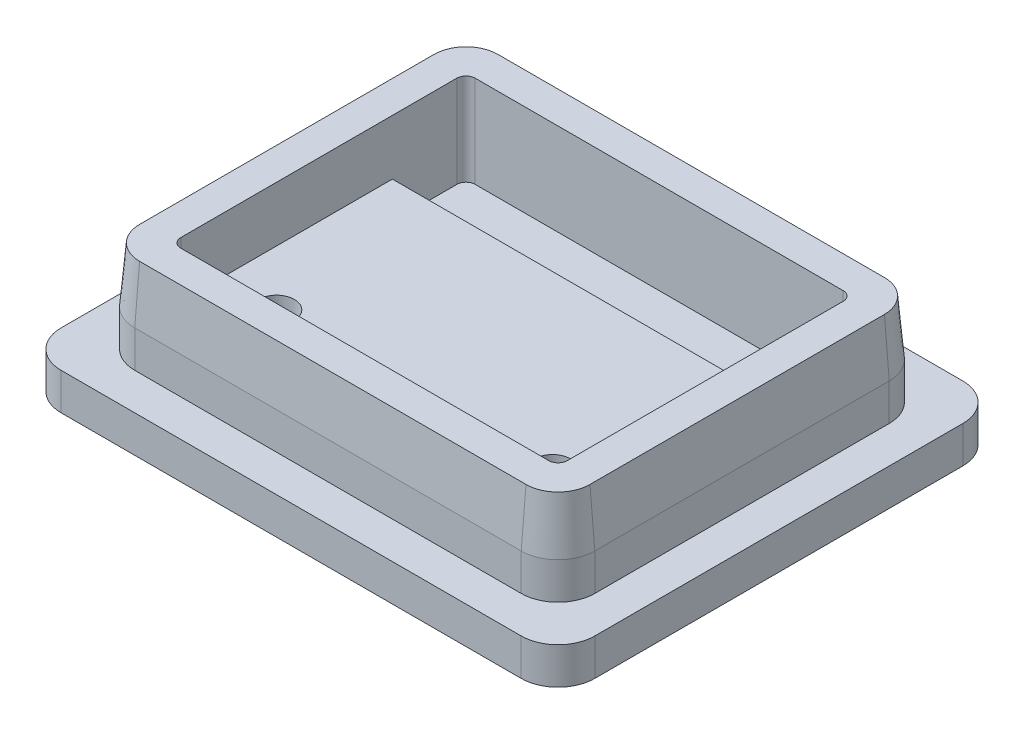
ISO-10303-21;
HEADER;
FILE_DESCRIPTION(('STEP AP214'),'2;1');
FILE_NAME('part.step','',(''),(''),'','','');
FILE_SCHEMA(('AUTOMOTIVE_DESIGN { 1 0 10303 214 1 1 1 1 }'));
ENDSEC;
DATA;
#1=APPLICATION_CONTEXT('core data for automotive mechanical design processes');
#2=APPLICATION_PROTOCOL_DEFINITION('international standard','automotive_design',2000,#1);
#3=PRODUCT_CONTEXT('',#1,'mechanical');
#4=PRODUCT('Part','Part','',(#3));
#5=PRODUCT_RELATED_PRODUCT_CATEGORY('part','',(#4));
#6=PRODUCT_DEFINITION_FORMATION('','',#4);
#7=PRODUCT_DEFINITION_CONTEXT('part definition',#1,'design');
#8=PRODUCT_DEFINITION('design','',#6,#7);
#9=PRODUCT_DEFINITION_SHAPE('','',#8);
#10=(LENGTH_UNIT() NAMED_UNIT(*) SI_UNIT(.MILLI.,.METRE.));
#11=(NAMED_UNIT(*) PLANE_ANGLE_UNIT() SI_UNIT($,.RADIAN.));
#12=(NAMED_UNIT(*) SI_UNIT($,.STERADIAN.) SOLID_ANGLE_UNIT());
#13=UNCERTAINTY_MEASURE_WITH_UNIT(LENGTH_MEASURE(1.E-05),#10,'distance_accuracy_value','');
#14=(GEOMETRIC_REPRESENTATION_CONTEXT(3) GLOBAL_UNCERTAINTY_ASSIGNED_CONTEXT((#13)) GLOBAL_UNIT_ASSIGNED_CONTEXT((#10,
#11,#12)) REPRESENTATION_CONTEXT('',''));
#15=CARTESIAN_POINT('',(0.,0.,0.));
#16=DIRECTION('',(0.,0.,1.));
#17=DIRECTION('',(1.,0.,0.));
#18=AXIS2_PLACEMENT_3D('',#15,#16,#17);
#19=CARTESIAN_POINT('',(0.,2.,0.));
#20=DIRECTION('',(0.,-1.,0.));
#21=DIRECTION('',(0.,0.,-1.));
#22=AXIS2_PLACEMENT_3D('',#19,#20,#21);
#23=PLANE('',#22);
#24=DIRECTION('',(1.,0.,0.));
#25=VECTOR('',#24,1.);
#26=CARTESIAN_POINT('',(-14.5,2.,12.));
#27=LINE('',#26,#25);
#28=CARTESIAN_POINT('',(-12.5,2.,12.));
#29=VERTEX_POINT('',#28);
#30=CARTESIAN_POINT('',(12.5,2.,12.));
#31=VERTEX_POINT('',#30);
#32=EDGE_CURVE('E349',#29,#31,#27,.T.);
#33=ORIENTED_EDGE('',*,*,#32,.T.);
#34=CARTESIAN_POINT('',(12.5,2.,10.));
#35=DIRECTION('',(0.,-1.,0.));
#36=DIRECTION('',(0.,0.,-1.));
#37=AXIS2_PLACEMENT_3D('',#34,#35,#36);
#38=CIRCLE('',#37,2.);
#39=CARTESIAN_POINT('',(14.5,2.,10.));
#40=VERTEX_POINT('',#39);
#41=EDGE_CURVE('E428',#31,#40,#38,.F.);
#42=ORIENTED_EDGE('',*,*,#41,.T.);
#43=DIRECTION('',(0.,0.,-1.));
#44=VECTOR('',#43,1.);
#45=CARTESIAN_POINT('',(14.5,2.,12.));
#46=LINE('',#45,#44);
#47=CARTESIAN_POINT('',(14.5,2.,-10.));
#48=VERTEX_POINT('',#47);
#49=EDGE_CURVE('E336',#40,#48,#46,.T.);
#50=ORIENTED_EDGE('',*,*,#49,.T.);
#51=CARTESIAN_POINT('',(12.5,2.,-10.));
#52=DIRECTION('',(0.,-1.,0.));
#53=DIRECTION('',(0.,0.,-1.));
#54=AXIS2_PLACEMENT_3D('',#51,#52,#53);
#55=CIRCLE('',#54,2.);
#56=CARTESIAN_POINT('',(12.5,2.,-12.));
#57=VERTEX_POINT('',#56);
#58=EDGE_CURVE('E419',#48,#57,#55,.F.);
#59=ORIENTED_EDGE('',*,*,#58,.T.);
#60=DIRECTION('',(-1.,0.,0.));
#61=VECTOR('',#60,1.);
#62=CARTESIAN_POINT('',(-14.5,2.,-12.));
#63=LINE('',#62,#61);
#64=CARTESIAN_POINT('',(-12.5,2.,-12.));
#65=VERTEX_POINT('',#64);
#66=EDGE_CURVE('E340',#57,#65,#63,.T.);
#67=ORIENTED_EDGE('',*,*,#66,.T.);
#68=CARTESIAN_POINT('',(-12.5,2.,-10.));
#69=DIRECTION('',(0.,-1.,0.));
#70=DIRECTION('',(0.,0.,-1.));
#71=AXIS2_PLACEMENT_3D('',#68,#69,#70);
#72=CIRCLE('',#71,2.);
#73=CARTESIAN_POINT('',(-14.5,2.,-10.));
#74=VERTEX_POINT('',#73);
#75=EDGE_CURVE('E422',#65,#74,#72,.F.);
#76=ORIENTED_EDGE('',*,*,#75,.T.);
#77=DIRECTION('',(0.,0.,1.));
#78=VECTOR('',#77,1.);
#79=CARTESIAN_POINT('',(-14.5,2.,12.));
#80=LINE('',#79,#78);
#81=CARTESIAN_POINT('',(-14.5,2.,10.));
#82=VERTEX_POINT('',#81);
#83=EDGE_CURVE('E345',#74,#82,#80,.T.);
#84=ORIENTED_EDGE('',*,*,#83,.T.);
#85=CARTESIAN_POINT('',(-12.5,2.,10.));
#86=DIRECTION('',(0.,-1.,0.));
#87=DIRECTION('',(0.,0.,-1.));
#88=AXIS2_PLACEMENT_3D('',#85,#86,#87);
#89=CIRCLE('',#88,2.);
#90=EDGE_CURVE('E425',#82,#29,#89,.F.);
#91=ORIENTED_EDGE('',*,*,#90,.T.);
#92=EDGE_LOOP('',(#33,#42,#50,#59,#67,#76,#84,#91));
#93=FACE_BOUND('',#92,.T.);
#94=DIRECTION('',(0.,0.,1.));
#95=VECTOR('',#94,1.);
#96=CARTESIAN_POINT('',(-12.5,2.,10.));
#97=LINE('',#96,#95);
#98=CARTESIAN_POINT('',(-12.5,2.,-8.));
#99=VERTEX_POINT('',#98);
#100=CARTESIAN_POINT('',(-12.5,2.,8.));
#101=VERTEX_POINT('',#100);
#102=EDGE_CURVE('E315',#99,#101,#97,.T.);
#103=ORIENTED_EDGE('',*,*,#102,.F.);
#104=CARTESIAN_POINT('',(-10.5,2.,-8.));
#105=DIRECTION('',(0.,-1.,0.));
#106=DIRECTION('',(0.,0.,-1.));
#107=AXIS2_PLACEMENT_3D('',#104,#105,#106);
#108=CIRCLE('',#107,2.);
#109=CARTESIAN_POINT('',(-10.5,2.,-10.));
#110=VERTEX_POINT('',#109);
#111=EDGE_CURVE('E454',#99,#110,#108,.T.);
#112=ORIENTED_EDGE('',*,*,#111,.T.);
#113=DIRECTION('',(-1.,0.,0.));
#114=VECTOR('',#113,1.);
#115=CARTESIAN_POINT('',(-12.5,2.,-10.));
#116=LINE('',#115,#114);
#117=CARTESIAN_POINT('',(10.5,2.,-10.));
#118=VERTEX_POINT('',#117);
#119=EDGE_CURVE('E331',#118,#110,#116,.T.);
#120=ORIENTED_EDGE('',*,*,#119,.F.);
#121=CARTESIAN_POINT('',(10.5,2.,-8.));
#122=DIRECTION('',(0.,-1.,0.));
#123=DIRECTION('',(0.,0.,-1.));
#124=AXIS2_PLACEMENT_3D('',#121,#122,#123);
#125=CIRCLE('',#124,2.);
#126=CARTESIAN_POINT('',(12.5,2.,-8.));
#127=VERTEX_POINT('',#126);
#128=EDGE_CURVE('E445',#118,#127,#125,.T.);
#129=ORIENTED_EDGE('',*,*,#128,.T.);
#130=DIRECTION('',(0.,0.,-1.));
#131=VECTOR('',#130,1.);
#132=CARTESIAN_POINT('',(12.5,2.,10.));
#133=LINE('',#132,#131);
#134=CARTESIAN_POINT('',(12.5,2.,8.));
#135=VERTEX_POINT('',#134);
#136=EDGE_CURVE('E327',#135,#127,#133,.T.);
#137=ORIENTED_EDGE('',*,*,#136,.F.);
#138=CARTESIAN_POINT('',(10.5,2.,8.));
#139=DIRECTION('',(0.,-1.,0.));
#140=DIRECTION('',(0.,0.,-1.));
#141=AXIS2_PLACEMENT_3D('',#138,#139,#140);
#142=CIRCLE('',#141,2.);
#143=CARTESIAN_POINT('',(10.5,2.,10.));
#144=VERTEX_POINT('',#143);
#145=EDGE_CURVE('E448',#135,#144,#142,.T.);
#146=ORIENTED_EDGE('',*,*,#145,.T.);
#147=DIRECTION('',(1.,0.,0.));
#148=VECTOR('',#147,1.);
#149=CARTESIAN_POINT('',(-12.5,2.,10.));
#150=LINE('',#149,#148);
#151=CARTESIAN_POINT('',(-10.5,2.,10.));
#152=VERTEX_POINT('',#151);
#153=EDGE_CURVE('E323',#152,#144,#150,.T.);
#154=ORIENTED_EDGE('',*,*,#153,.F.);
#155=CARTESIAN_POINT('',(-10.5,2.,8.));
#156=DIRECTION('',(0.,-1.,0.));
#157=DIRECTION('',(0.,0.,-1.));
#158=AXIS2_PLACEMENT_3D('',#155,#156,#157);
#159=CIRCLE('',#158,2.);
#160=EDGE_CURVE('E451',#152,#101,#159,.T.);
#161=ORIENTED_EDGE('',*,*,#160,.T.);
#162=EDGE_LOOP('',(#103,#112,#120,#129,#137,#146,#154,#161));
#163=FACE_BOUND('',#162,.T.);
#164=ADVANCED_FACE('F51',(#93,#163),#23,.F.);
#165=CARTESIAN_POINT('',(14.5,2.,12.));
#166=DIRECTION('',(-1.,0.,0.));
#167=DIRECTION('',(0.,0.,1.));
#168=AXIS2_PLACEMENT_3D('',#165,#166,#167);
#169=PLANE('',#168);
#170=ORIENTED_EDGE('',*,*,#49,.F.);
#171=DIRECTION('',(0.,-1.,0.));
#172=VECTOR('',#171,1.);
#173=CARTESIAN_POINT('',(14.5,2.,10.));
#174=LINE('',#173,#172);
#175=CARTESIAN_POINT('',(14.5,0.,10.));
#176=VERTEX_POINT('',#175);
#177=EDGE_CURVE('E396',#40,#176,#174,.T.);
#178=ORIENTED_EDGE('',*,*,#177,.T.);
#179=DIRECTION('',(0.,0.,-1.));
#180=VECTOR('',#179,1.);
#181=CARTESIAN_POINT('',(14.5,0.,12.));
#182=LINE('',#181,#180);
#183=CARTESIAN_POINT('',(14.5,0.,-10.));
#184=VERTEX_POINT('',#183);
#185=EDGE_CURVE('E335',#176,#184,#182,.T.);
#186=ORIENTED_EDGE('',*,*,#185,.T.);
#187=DIRECTION('',(0.,-1.,0.));
#188=VECTOR('',#187,1.);
#189=CARTESIAN_POINT('',(14.5,2.,-10.));
#190=LINE('',#189,#188);
#191=EDGE_CURVE('E393',#184,#48,#190,.F.);
#192=ORIENTED_EDGE('',*,*,#191,.T.);
#193=EDGE_LOOP('',(#170,#178,#186,#192));
#194=FACE_BOUND('',#193,.T.);
#195=ADVANCED_FACE('F655',(#194),#169,.F.);
#196=CARTESIAN_POINT('',(-14.5,2.,-12.));
#197=DIRECTION('',(0.,0.,1.));
#198=DIRECTION('',(1.,0.,0.));
#199=AXIS2_PLACEMENT_3D('',#196,#197,#198);
#200=PLANE('',#199);
#201=DIRECTION('',(-1.,0.,0.));
#202=VECTOR('',#201,1.);
#203=CARTESIAN_POINT('',(-14.5,0.,-12.));
#204=LINE('',#203,#202);
#205=CARTESIAN_POINT('',(12.5,0.,-12.));
#206=VERTEX_POINT('',#205);
#207=CARTESIAN_POINT('',(-12.5,0.,-12.));
#208=VERTEX_POINT('',#207);
#209=EDGE_CURVE('E357',#206,#208,#204,.T.);
#210=ORIENTED_EDGE('',*,*,#209,.T.);
#211=DIRECTION('',(0.,-1.,0.));
#212=VECTOR('',#211,1.);
#213=CARTESIAN_POINT('',(-12.5,2.,-12.));
#214=LINE('',#213,#212);
#215=EDGE_CURVE('E442',#208,#65,#214,.F.);
#216=ORIENTED_EDGE('',*,*,#215,.T.);
#217=ORIENTED_EDGE('',*,*,#66,.F.);
#218=DIRECTION('',(0.,-1.,0.));
#219=VECTOR('',#218,1.);
#220=CARTESIAN_POINT('',(12.5,2.,-12.));
#221=LINE('',#220,#219);
#222=EDGE_CURVE('E438',#57,#206,#221,.T.);
#223=ORIENTED_EDGE('',*,*,#222,.T.);
#224=EDGE_LOOP('',(#210,#216,#217,#223));
#225=FACE_BOUND('',#224,.T.);
#226=ADVANCED_FACE('F661',(#225),#200,.F.);
#227=CARTESIAN_POINT('',(-14.5,2.,12.));
#228=DIRECTION('',(1.,0.,0.));
#229=DIRECTION('',(0.,0.,-1.));
#230=AXIS2_PLACEMENT_3D('',#227,#228,#229);
#231=PLANE('',#230);
#232=DIRECTION('',(0.,0.,1.));
#233=VECTOR('',#232,1.);
#234=CARTESIAN_POINT('',(-14.5,0.,12.));
#235=LINE('',#234,#233);
#236=CARTESIAN_POINT('',(-14.5,0.,-10.));
#237=VERTEX_POINT('',#236);
#238=CARTESIAN_POINT('',(-14.5,0.,10.));
#239=VERTEX_POINT('',#238);
#240=EDGE_CURVE('E361',#237,#239,#235,.T.);
#241=ORIENTED_EDGE('',*,*,#240,.T.);
#242=DIRECTION('',(0.,-1.,0.));
#243=VECTOR('',#242,1.);
#244=CARTESIAN_POINT('',(-14.5,2.,10.));
#245=LINE('',#244,#243);
#246=EDGE_CURVE('E435',#239,#82,#245,.F.);
#247=ORIENTED_EDGE('',*,*,#246,.T.);
#248=ORIENTED_EDGE('',*,*,#83,.F.);
#249=DIRECTION('',(0.,-1.,0.));
#250=VECTOR('',#249,1.);
#251=CARTESIAN_POINT('',(-14.5,2.,-10.));
#252=LINE('',#251,#250);
#253=EDGE_CURVE('E431',#74,#237,#252,.T.);
#254=ORIENTED_EDGE('',*,*,#253,.T.);
#255=EDGE_LOOP('',(#241,#247,#248,#254));
#256=FACE_BOUND('',#255,.T.);
#257=ADVANCED_FACE('F1058',(#256),#231,.F.);
#258=CARTESIAN_POINT('',(-14.5,2.,12.));
#259=DIRECTION('',(0.,0.,-1.));
#260=DIRECTION('',(-1.,0.,0.));
#261=AXIS2_PLACEMENT_3D('',#258,#259,#260);
#262=PLANE('',#261);
#263=DIRECTION('',(1.,0.,0.));
#264=VECTOR('',#263,1.);
#265=CARTESIAN_POINT('',(-14.5,0.,12.));
#266=LINE('',#265,#264);
#267=CARTESIAN_POINT('',(-12.5,0.,12.));
#268=VERTEX_POINT('',#267);
#269=CARTESIAN_POINT('',(12.5,0.,12.));
#270=VERTEX_POINT('',#269);
#271=EDGE_CURVE('E341',#268,#270,#266,.T.);
#272=ORIENTED_EDGE('',*,*,#271,.T.);
#273=DIRECTION('',(0.,-1.,0.));
#274=VECTOR('',#273,1.);
#275=CARTESIAN_POINT('',(12.5,2.,12.));
#276=LINE('',#275,#274);
#277=EDGE_CURVE('E416',#270,#31,#276,.F.);
#278=ORIENTED_EDGE('',*,*,#277,.T.);
#279=ORIENTED_EDGE('',*,*,#32,.F.);
#280=DIRECTION('',(0.,-1.,0.));
#281=VECTOR('',#280,1.);
#282=CARTESIAN_POINT('',(-12.5,2.,12.));
#283=LINE('',#282,#281);
#284=EDGE_CURVE('E412',#29,#268,#283,.T.);
#285=ORIENTED_EDGE('',*,*,#284,.T.);
#286=EDGE_LOOP('',(#272,#278,#279,#285));
#287=FACE_BOUND('',#286,.T.);
#288=ADVANCED_FACE('F1043',(#287),#262,.F.);
#289=CARTESIAN_POINT('',(0.,0.,0.));
#290=DIRECTION('',(0.,-1.,0.));
#291=DIRECTION('',(0.,0.,-1.));
#292=AXIS2_PLACEMENT_3D('',#289,#290,#291);
#293=PLANE('',#292);
#294=ORIENTED_EDGE('',*,*,#185,.F.);
#295=CARTESIAN_POINT('',(12.5,0.,10.));
#296=DIRECTION('',(0.,-1.,0.));
#297=DIRECTION('',(0.,0.,-1.));
#298=AXIS2_PLACEMENT_3D('',#295,#296,#297);
#299=CIRCLE('',#298,2.);
#300=EDGE_CURVE('E409',#176,#270,#299,.T.);
#301=ORIENTED_EDGE('',*,*,#300,.T.);
#302=ORIENTED_EDGE('',*,*,#271,.F.);
#303=CARTESIAN_POINT('',(-12.5,0.,10.));
#304=DIRECTION('',(0.,-1.,0.));
#305=DIRECTION('',(0.,0.,-1.));
#306=AXIS2_PLACEMENT_3D('',#303,#304,#305);
#307=CIRCLE('',#306,2.);
#308=EDGE_CURVE('E406',#268,#239,#307,.T.);
#309=ORIENTED_EDGE('',*,*,#308,.T.);
#310=ORIENTED_EDGE('',*,*,#240,.F.);
#311=CARTESIAN_POINT('',(-12.5,0.,-10.));
#312=DIRECTION('',(0.,-1.,0.));
#313=DIRECTION('',(0.,0.,-1.));
#314=AXIS2_PLACEMENT_3D('',#311,#312,#313);
#315=CIRCLE('',#314,2.);
#316=EDGE_CURVE('E403',#237,#208,#315,.T.);
#317=ORIENTED_EDGE('',*,*,#316,.T.);
#318=ORIENTED_EDGE('',*,*,#209,.F.);
#319=CARTESIAN_POINT('',(12.5,0.,-10.));
#320=DIRECTION('',(0.,-1.,0.));
#321=DIRECTION('',(0.,0.,-1.));
#322=AXIS2_PLACEMENT_3D('',#319,#320,#321);
#323=CIRCLE('',#322,2.);
#324=EDGE_CURVE('E400',#206,#184,#323,.T.);
#325=ORIENTED_EDGE('',*,*,#324,.T.);
#326=EDGE_LOOP('',(#294,#301,#302,#309,#310,#317,#318,#325));
#327=FACE_BOUND('',#326,.T.);
#328=ADVANCED_FACE('F707',(#327),#293,.T.);
#329=CARTESIAN_POINT('',(0.,7.,0.));
#330=DIRECTION('',(0.,-1.,0.));
#331=DIRECTION('',(0.,0.,-1.));
#332=AXIS2_PLACEMENT_3D('',#329,#330,#331);
#333=PLANE('',#332);
#334=DIRECTION('',(0.,0.,1.));
#335=VECTOR('',#334,1.);
#336=CARTESIAN_POINT('',(-12.2375340094222,7.,0.));
#337=LINE('',#336,#335);
#338=CARTESIAN_POINT('',(-12.2375340094222,7.,-8.));
#339=VERTEX_POINT('',#338);
#340=CARTESIAN_POINT('',(-12.2375340094222,7.,8.));
#341=VERTEX_POINT('',#340);
#342=EDGE_CURVE('E521',#339,#341,#337,.T.);
#343=ORIENTED_EDGE('',*,*,#342,.T.);
#344=CARTESIAN_POINT('',(-10.5,7.,8.));
#345=DIRECTION('',(0.,-1.,0.));
#346=DIRECTION('',(0.,0.,-1.));
#347=AXIS2_PLACEMENT_3D('',#344,#345,#346);
#348=CIRCLE('',#347,1.73753400942221);
#349=CARTESIAN_POINT('',(-10.5,7.,9.73753400942221));
#350=VERTEX_POINT('',#349);
#351=EDGE_CURVE('E527',#341,#350,#348,.F.);
#352=ORIENTED_EDGE('',*,*,#351,.T.);
#353=DIRECTION('',(1.,0.,0.));
#354=VECTOR('',#353,1.);
#355=CARTESIAN_POINT('',(0.,7.,9.73753400942221));
#356=LINE('',#355,#354);
#357=CARTESIAN_POINT('',(10.5,7.,9.73753400942221));
#358=VERTEX_POINT('',#357);
#359=EDGE_CURVE('E524',#350,#358,#356,.T.);
#360=ORIENTED_EDGE('',*,*,#359,.T.);
#361=CARTESIAN_POINT('',(10.5,7.,8.));
#362=DIRECTION('',(0.,-1.,0.));
#363=DIRECTION('',(0.,0.,-1.));
#364=AXIS2_PLACEMENT_3D('',#361,#362,#363);
#365=CIRCLE('',#364,1.73753400942221);
#366=CARTESIAN_POINT('',(12.2375340094222,7.,8.));
#367=VERTEX_POINT('',#366);
#368=EDGE_CURVE('E518',#358,#367,#365,.F.);
#369=ORIENTED_EDGE('',*,*,#368,.T.);
#370=DIRECTION('',(0.,0.,-1.));
#371=VECTOR('',#370,1.);
#372=CARTESIAN_POINT('',(12.2375340094222,7.,0.));
#373=LINE('',#372,#371);
#374=CARTESIAN_POINT('',(12.2375340094222,7.,-8.));
#375=VERTEX_POINT('',#374);
#376=EDGE_CURVE('E512',#367,#375,#373,.T.);
#377=ORIENTED_EDGE('',*,*,#376,.T.);
#378=CARTESIAN_POINT('',(10.5,7.,-8.));
#379=DIRECTION('',(0.,-1.,0.));
#380=DIRECTION('',(0.,0.,-1.));
#381=AXIS2_PLACEMENT_3D('',#378,#379,#380);
#382=CIRCLE('',#381,1.73753400942221);
#383=CARTESIAN_POINT('',(10.5,7.,-9.73753400942221));
#384=VERTEX_POINT('',#383);
#385=EDGE_CURVE('E506',#375,#384,#382,.F.);
#386=ORIENTED_EDGE('',*,*,#385,.T.);
#387=DIRECTION('',(-1.,0.,0.));
#388=VECTOR('',#387,1.);
#389=CARTESIAN_POINT('',(0.,7.,-9.73753400942221));
#390=LINE('',#389,#388);
#391=CARTESIAN_POINT('',(-10.5,7.,-9.73753400942221));
#392=VERTEX_POINT('',#391);
#393=EDGE_CURVE('E509',#384,#392,#390,.T.);
#394=ORIENTED_EDGE('',*,*,#393,.T.);
#395=CARTESIAN_POINT('',(-10.5,7.,-8.));
#396=DIRECTION('',(0.,-1.,0.));
#397=DIRECTION('',(0.,0.,-1.));
#398=AXIS2_PLACEMENT_3D('',#395,#396,#397);
#399=CIRCLE('',#398,1.73753400942221);
#400=EDGE_CURVE('E515',#392,#339,#399,.F.);
#401=ORIENTED_EDGE('',*,*,#400,.T.);
#402=EDGE_LOOP('',(#343,#352,#360,#369,#377,#386,#394,#401));
#403=FACE_BOUND('',#402,.T.);
#404=DIRECTION('',(0.,0.,-1.));
#405=VECTOR('',#404,1.);
#406=CARTESIAN_POINT('',(10.5,7.,8.));
#407=LINE('',#406,#405);
#408=CARTESIAN_POINT('',(10.5,7.,7.5));
#409=VERTEX_POINT('',#408);
#410=CARTESIAN_POINT('',(10.5,7.,-7.5));
#411=VERTEX_POINT('',#410);
#412=EDGE_CURVE('E262',#409,#411,#407,.T.);
#413=ORIENTED_EDGE('',*,*,#412,.F.);
#414=CARTESIAN_POINT('',(10.,7.,7.5));
#415=DIRECTION('',(0.,-1.,0.));
#416=DIRECTION('',(0.,0.,-1.));
#417=AXIS2_PLACEMENT_3D('',#414,#415,#416);
#418=CIRCLE('',#417,0.5);
#419=CARTESIAN_POINT('',(9.99999999999999,7.,8.));
#420=VERTEX_POINT('',#419);
#421=EDGE_CURVE('E503',#409,#420,#418,.T.);
#422=ORIENTED_EDGE('',*,*,#421,.T.);
#423=DIRECTION('',(1.,0.,0.));
#424=VECTOR('',#423,1.);
#425=CARTESIAN_POINT('',(-10.5,7.,8.));
#426=LINE('',#425,#424);
#427=CARTESIAN_POINT('',(-10.,7.,8.));
#428=VERTEX_POINT('',#427);
#429=EDGE_CURVE('E311',#428,#420,#426,.T.);
#430=ORIENTED_EDGE('',*,*,#429,.F.);
#431=CARTESIAN_POINT('',(-10.,7.,7.5));
#432=DIRECTION('',(0.,-1.,0.));
#433=DIRECTION('',(0.,0.,-1.));
#434=AXIS2_PLACEMENT_3D('',#431,#432,#433);
#435=CIRCLE('',#434,0.5);
#436=CARTESIAN_POINT('',(-10.5,7.,7.5));
#437=VERTEX_POINT('',#436);
#438=EDGE_CURVE('E494',#428,#437,#435,.T.);
#439=ORIENTED_EDGE('',*,*,#438,.T.);
#440=DIRECTION('',(0.,0.,1.));
#441=VECTOR('',#440,1.);
#442=CARTESIAN_POINT('',(-10.5,7.,8.));
#443=LINE('',#442,#441);
#444=CARTESIAN_POINT('',(-10.5,7.,-7.5));
#445=VERTEX_POINT('',#444);
#446=EDGE_CURVE('E308',#445,#437,#443,.T.);
#447=ORIENTED_EDGE('',*,*,#446,.F.);
#448=CARTESIAN_POINT('',(-10.,7.,-7.5));
#449=DIRECTION('',(0.,-1.,0.));
#450=DIRECTION('',(0.,0.,-1.));
#451=AXIS2_PLACEMENT_3D('',#448,#449,#450);
#452=CIRCLE('',#451,0.5);
#453=CARTESIAN_POINT('',(-10.,7.,-8.));
#454=VERTEX_POINT('',#453);
#455=EDGE_CURVE('E497',#445,#454,#452,.T.);
#456=ORIENTED_EDGE('',*,*,#455,.T.);
#457=DIRECTION('',(-1.,0.,0.));
#458=VECTOR('',#457,1.);
#459=CARTESIAN_POINT('',(-10.5,7.,-8.));
#460=LINE('',#459,#458);
#461=CARTESIAN_POINT('',(9.99999999999999,7.,-8.));
#462=VERTEX_POINT('',#461);
#463=EDGE_CURVE('E304',#462,#454,#460,.T.);
#464=ORIENTED_EDGE('',*,*,#463,.F.);
#465=CARTESIAN_POINT('',(10.,7.,-7.5));
#466=DIRECTION('',(0.,-1.,0.));
#467=DIRECTION('',(0.,0.,-1.));
#468=AXIS2_PLACEMENT_3D('',#465,#466,#467);
#469=CIRCLE('',#468,0.5);
#470=EDGE_CURVE('E500',#462,#411,#469,.T.);
#471=ORIENTED_EDGE('',*,*,#470,.T.);
#472=EDGE_LOOP('',(#413,#422,#430,#439,#447,#456,#464,#471));
#473=FACE_BOUND('',#472,.T.);
#474=ADVANCED_FACE('F625',(#403,#473),#333,.F.);
#475=CARTESIAN_POINT('',(-12.5,7.,10.));
#476=DIRECTION('',(1.,0.,0.));
#477=DIRECTION('',(0.,0.,-1.));
#478=AXIS2_PLACEMENT_3D('',#475,#476,#477);
#479=PLANE('',#478);
#480=DIRECTION('',(0.,-1.,0.));
#481=VECTOR('',#480,1.);
#482=CARTESIAN_POINT('',(-12.5,7.,8.));
#483=LINE('',#482,#481);
#484=CARTESIAN_POINT('',(-12.5,3.99999999999971,8.));
#485=VERTEX_POINT('',#484);
#486=EDGE_CURVE('E389',#101,#485,#483,.F.);
#487=ORIENTED_EDGE('',*,*,#486,.T.);
#488=DIRECTION('',(0.,0.,-1.));
#489=VECTOR('',#488,1.);
#490=CARTESIAN_POINT('',(-12.5,3.99999999999971,10.));
#491=LINE('',#490,#489);
#492=CARTESIAN_POINT('',(-12.5,3.99999999999971,-8.));
#493=VERTEX_POINT('',#492);
#494=EDGE_CURVE('E538',#485,#493,#491,.T.);
#495=ORIENTED_EDGE('',*,*,#494,.T.);
#496=DIRECTION('',(0.,-1.,0.));
#497=VECTOR('',#496,1.);
#498=CARTESIAN_POINT('',(-12.5,7.,-8.));
#499=LINE('',#498,#497);
#500=EDGE_CURVE('E386',#493,#99,#499,.T.);
#501=ORIENTED_EDGE('',*,*,#500,.T.);
#502=ORIENTED_EDGE('',*,*,#102,.T.);
#503=EDGE_LOOP('',(#487,#495,#501,#502));
#504=FACE_BOUND('',#503,.T.);
#505=ADVANCED_FACE('F706',(#504),#479,.F.);
#506=CARTESIAN_POINT('',(-12.5,7.,10.));
#507=DIRECTION('',(0.,0.,-1.));
#508=DIRECTION('',(-1.,0.,0.));
#509=AXIS2_PLACEMENT_3D('',#506,#507,#508);
#510=PLANE('',#509);
#511=DIRECTION('',(0.,-1.,0.));
#512=VECTOR('',#511,1.);
#513=CARTESIAN_POINT('',(10.5,7.,10.));
#514=LINE('',#513,#512);
#515=CARTESIAN_POINT('',(10.5,3.99999999999971,10.));
#516=VERTEX_POINT('',#515);
#517=EDGE_CURVE('E382',#144,#516,#514,.F.);
#518=ORIENTED_EDGE('',*,*,#517,.T.);
#519=DIRECTION('',(-1.,0.,0.));
#520=VECTOR('',#519,1.);
#521=CARTESIAN_POINT('',(-12.5,3.99999999999971,10.));
#522=LINE('',#521,#520);
#523=CARTESIAN_POINT('',(-10.5,3.99999999999971,10.));
#524=VERTEX_POINT('',#523);
#525=EDGE_CURVE('E535',#516,#524,#522,.T.);
#526=ORIENTED_EDGE('',*,*,#525,.T.);
#527=DIRECTION('',(0.,-1.,0.));
#528=VECTOR('',#527,1.);
#529=CARTESIAN_POINT('',(-10.5,7.,10.));
#530=LINE('',#529,#528);
#531=EDGE_CURVE('E379',#524,#152,#530,.T.);
#532=ORIENTED_EDGE('',*,*,#531,.T.);
#533=ORIENTED_EDGE('',*,*,#153,.T.);
#534=EDGE_LOOP('',(#518,#526,#532,#533));
#535=FACE_BOUND('',#534,.T.);
#536=ADVANCED_FACE('F714',(#535),#510,.F.);
#537=CARTESIAN_POINT('',(12.5,7.,10.));
#538=DIRECTION('',(-1.,0.,0.));
#539=DIRECTION('',(0.,0.,1.));
#540=AXIS2_PLACEMENT_3D('',#537,#538,#539);
#541=PLANE('',#540);
#542=DIRECTION('',(0.,-1.,0.));
#543=VECTOR('',#542,1.);
#544=CARTESIAN_POINT('',(12.5,7.,-8.));
#545=LINE('',#544,#543);
#546=CARTESIAN_POINT('',(12.5,3.99999999999971,-8.));
#547=VERTEX_POINT('',#546);
#548=EDGE_CURVE('E376',#127,#547,#545,.F.);
#549=ORIENTED_EDGE('',*,*,#548,.T.);
#550=DIRECTION('',(0.,0.,1.));
#551=VECTOR('',#550,1.);
#552=CARTESIAN_POINT('',(12.5,3.99999999999971,10.));
#553=LINE('',#552,#551);
#554=CARTESIAN_POINT('',(12.5,3.99999999999971,8.));
#555=VERTEX_POINT('',#554);
#556=EDGE_CURVE('E547',#547,#555,#553,.T.);
#557=ORIENTED_EDGE('',*,*,#556,.T.);
#558=DIRECTION('',(0.,-1.,0.));
#559=VECTOR('',#558,1.);
#560=CARTESIAN_POINT('',(12.5,7.,8.));
#561=LINE('',#560,#559);
#562=EDGE_CURVE('E373',#555,#135,#561,.T.);
#563=ORIENTED_EDGE('',*,*,#562,.T.);
#564=ORIENTED_EDGE('',*,*,#136,.T.);
#565=EDGE_LOOP('',(#549,#557,#563,#564));
#566=FACE_BOUND('',#565,.T.);
#567=ADVANCED_FACE('F711',(#566),#541,.F.);
#568=CARTESIAN_POINT('',(-12.5,7.,-10.));
#569=DIRECTION('',(0.,0.,1.));
#570=DIRECTION('',(1.,0.,0.));
#571=AXIS2_PLACEMENT_3D('',#568,#569,#570);
#572=PLANE('',#571);
#573=DIRECTION('',(0.,-1.,0.));
#574=VECTOR('',#573,1.);
#575=CARTESIAN_POINT('',(-10.5,7.,-10.));
#576=LINE('',#575,#574);
#577=CARTESIAN_POINT('',(-10.5,3.99999999999971,-10.));
#578=VERTEX_POINT('',#577);
#579=EDGE_CURVE('E353',#110,#578,#576,.F.);
#580=ORIENTED_EDGE('',*,*,#579,.T.);
#581=DIRECTION('',(1.,0.,0.));
#582=VECTOR('',#581,1.);
#583=CARTESIAN_POINT('',(-12.5,3.99999999999971,-10.));
#584=LINE('',#583,#582);
#585=CARTESIAN_POINT('',(10.5,3.99999999999971,-10.));
#586=VERTEX_POINT('',#585);
#587=EDGE_CURVE('E62',#578,#586,#584,.T.);
#588=ORIENTED_EDGE('',*,*,#587,.T.);
#589=DIRECTION('',(0.,-1.,0.));
#590=VECTOR('',#589,1.);
#591=CARTESIAN_POINT('',(10.5,7.,-10.));
#592=LINE('',#591,#590);
#593=EDGE_CURVE('E370',#586,#118,#592,.T.);
#594=ORIENTED_EDGE('',*,*,#593,.T.);
#595=ORIENTED_EDGE('',*,*,#119,.T.);
#596=EDGE_LOOP('',(#580,#588,#594,#595));
#597=FACE_BOUND('',#596,.T.);
#598=ADVANCED_FACE('F703',(#597),#572,.F.);
#599=CARTESIAN_POINT('',(10.5,7.,8.));
#600=DIRECTION('',(-1.,0.,0.));
#601=DIRECTION('',(0.,0.,1.));
#602=AXIS2_PLACEMENT_3D('',#599,#600,#601);
#603=PLANE('',#602);
#604=ORIENTED_EDGE('',*,*,#412,.T.);
#605=DIRECTION('',(0.,-1.,0.));
#606=VECTOR('',#605,1.);
#607=CARTESIAN_POINT('',(10.5,2.,-7.5));
#608=LINE('',#607,#606);
#609=CARTESIAN_POINT('',(10.5,2.,-7.5));
#610=VERTEX_POINT('',#609);
#611=EDGE_CURVE('E490',#411,#610,#608,.T.);
#612=ORIENTED_EDGE('',*,*,#611,.T.);
#613=DIRECTION('',(0.,0.,-1.));
#614=VECTOR('',#613,1.);
#615=CARTESIAN_POINT('',(10.5,2.,8.));
#616=LINE('',#615,#614);
#617=CARTESIAN_POINT('',(10.5,2.,-4.));
#618=VERTEX_POINT('',#617);
#619=EDGE_CURVE('E300',#618,#610,#616,.T.);
#620=ORIENTED_EDGE('',*,*,#619,.F.);
#621=DIRECTION('',(0.,-1.,0.));
#622=VECTOR('',#621,1.);
#623=CARTESIAN_POINT('',(10.5,4.,-4.));
#624=LINE('',#623,#622);
#625=CARTESIAN_POINT('',(10.5,4.,-4.));
#626=VERTEX_POINT('',#625);
#627=EDGE_CURVE('E276',#626,#618,#624,.T.);
#628=ORIENTED_EDGE('',*,*,#627,.F.);
#629=DIRECTION('',(0.,0.,-1.));
#630=VECTOR('',#629,1.);
#631=CARTESIAN_POINT('',(10.5,4.,8.));
#632=LINE('',#631,#630);
#633=CARTESIAN_POINT('',(10.5,4.,7.5));
#634=VERTEX_POINT('',#633);
#635=EDGE_CURVE('E603',#634,#626,#632,.T.);
#636=ORIENTED_EDGE('',*,*,#635,.F.);
#637=DIRECTION('',(0.,-1.,0.));
#638=VECTOR('',#637,1.);
#639=CARTESIAN_POINT('',(10.5,7.,7.5));
#640=LINE('',#639,#638);
#641=EDGE_CURVE('E487',#634,#409,#640,.F.);
#642=ORIENTED_EDGE('',*,*,#641,.T.);
#643=EDGE_LOOP('',(#604,#612,#620,#628,#636,#642));
#644=FACE_BOUND('',#643,.T.);
#645=ADVANCED_FACE('F641',(#644),#603,.T.);
#646=CARTESIAN_POINT('',(-10.5,7.,-8.));
#647=DIRECTION('',(0.,0.,1.));
#648=DIRECTION('',(1.,0.,0.));
#649=AXIS2_PLACEMENT_3D('',#646,#647,#648);
#650=PLANE('',#649);
#651=ORIENTED_EDGE('',*,*,#463,.T.);
#652=DIRECTION('',(0.,-1.,0.));
#653=VECTOR('',#652,1.);
#654=CARTESIAN_POINT('',(-10.,2.,-8.));
#655=LINE('',#654,#653);
#656=CARTESIAN_POINT('',(-10.,2.,-8.));
#657=VERTEX_POINT('',#656);
#658=EDGE_CURVE('E478',#454,#657,#655,.T.);
#659=ORIENTED_EDGE('',*,*,#658,.T.);
#660=DIRECTION('',(-1.,0.,0.));
#661=VECTOR('',#660,1.);
#662=CARTESIAN_POINT('',(-10.5,2.,-8.));
#663=LINE('',#662,#661);
#664=CARTESIAN_POINT('',(9.99999999999999,2.,-8.));
#665=VERTEX_POINT('',#664);
#666=EDGE_CURVE('E263',#665,#657,#663,.T.);
#667=ORIENTED_EDGE('',*,*,#666,.F.);
#668=DIRECTION('',(0.,-1.,0.));
#669=VECTOR('',#668,1.);
#670=CARTESIAN_POINT('',(10.,7.,-8.));
#671=LINE('',#670,#669);
#672=EDGE_CURVE('E476',#665,#462,#671,.F.);
#673=ORIENTED_EDGE('',*,*,#672,.T.);
#674=EDGE_LOOP('',(#651,#659,#667,#673));
#675=FACE_BOUND('',#674,.T.);
#676=ADVANCED_FACE('F633',(#675),#650,.T.);
#677=CARTESIAN_POINT('',(-10.5,7.,8.));
#678=DIRECTION('',(1.,0.,0.));
#679=DIRECTION('',(0.,0.,-1.));
#680=AXIS2_PLACEMENT_3D('',#677,#678,#679);
#681=PLANE('',#680);
#682=ORIENTED_EDGE('',*,*,#446,.T.);
#683=DIRECTION('',(0.,-1.,0.));
#684=VECTOR('',#683,1.);
#685=CARTESIAN_POINT('',(-10.5,4.,7.5));
#686=LINE('',#685,#684);
#687=CARTESIAN_POINT('',(-10.5,4.,7.5));
#688=VERTEX_POINT('',#687);
#689=EDGE_CURVE('E460',#437,#688,#686,.T.);
#690=ORIENTED_EDGE('',*,*,#689,.T.);
#691=DIRECTION('',(0.,0.,1.));
#692=VECTOR('',#691,1.);
#693=CARTESIAN_POINT('',(-10.5,4.,-4.));
#694=LINE('',#693,#692);
#695=CARTESIAN_POINT('',(-10.5,4.,-4.));
#696=VERTEX_POINT('',#695);
#697=EDGE_CURVE('E271',#696,#688,#694,.T.);
#698=ORIENTED_EDGE('',*,*,#697,.F.);
#699=DIRECTION('',(0.,-1.,0.));
#700=VECTOR('',#699,1.);
#701=CARTESIAN_POINT('',(-10.5,4.,-4.));
#702=LINE('',#701,#700);
#703=CARTESIAN_POINT('',(-10.5,2.,-4.));
#704=VERTEX_POINT('',#703);
#705=EDGE_CURVE('E266',#696,#704,#702,.T.);
#706=ORIENTED_EDGE('',*,*,#705,.T.);
#707=DIRECTION('',(0.,0.,1.));
#708=VECTOR('',#707,1.);
#709=CARTESIAN_POINT('',(-10.5,2.,8.));
#710=LINE('',#709,#708);
#711=CARTESIAN_POINT('',(-10.5,2.,-7.5));
#712=VERTEX_POINT('',#711);
#713=EDGE_CURVE('E250',#712,#704,#710,.T.);
#714=ORIENTED_EDGE('',*,*,#713,.F.);
#715=DIRECTION('',(0.,-1.,0.));
#716=VECTOR('',#715,1.);
#717=CARTESIAN_POINT('',(-10.5,7.,-7.5));
#718=LINE('',#717,#716);
#719=EDGE_CURVE('E457',#712,#445,#718,.F.);
#720=ORIENTED_EDGE('',*,*,#719,.T.);
#721=EDGE_LOOP('',(#682,#690,#698,#706,#714,#720));
#722=FACE_BOUND('',#721,.T.);
#723=ADVANCED_FACE('F268',(#722),#681,.T.);
#724=CARTESIAN_POINT('',(-10.5,7.,8.));
#725=DIRECTION('',(0.,0.,-1.));
#726=DIRECTION('',(-1.,0.,0.));
#727=AXIS2_PLACEMENT_3D('',#724,#725,#726);
#728=PLANE('',#727);
#729=DIRECTION('',(1.,0.,0.));
#730=VECTOR('',#729,1.);
#731=CARTESIAN_POINT('',(-10.5,4.,8.));
#732=LINE('',#731,#730);
#733=CARTESIAN_POINT('',(-10.,4.,8.));
#734=VERTEX_POINT('',#733);
#735=CARTESIAN_POINT('',(9.99999999999999,4.,8.));
#736=VERTEX_POINT('',#735);
#737=EDGE_CURVE('E289',#734,#736,#732,.T.);
#738=ORIENTED_EDGE('',*,*,#737,.F.);
#739=DIRECTION('',(0.,-1.,0.));
#740=VECTOR('',#739,1.);
#741=CARTESIAN_POINT('',(-10.,7.,8.));
#742=LINE('',#741,#740);
#743=EDGE_CURVE('E473',#734,#428,#742,.F.);
#744=ORIENTED_EDGE('',*,*,#743,.T.);
#745=ORIENTED_EDGE('',*,*,#429,.T.);
#746=DIRECTION('',(0.,-1.,0.));
#747=VECTOR('',#746,1.);
#748=CARTESIAN_POINT('',(10.,4.,8.));
#749=LINE('',#748,#747);
#750=EDGE_CURVE('E469',#420,#736,#749,.T.);
#751=ORIENTED_EDGE('',*,*,#750,.T.);
#752=EDGE_LOOP('',(#738,#744,#745,#751));
#753=FACE_BOUND('',#752,.T.);
#754=ADVANCED_FACE('F617',(#753),#728,.T.);
#755=ORIENTED_EDGE('',*,*,#666,.T.);
#756=CARTESIAN_POINT('',(-10.,2.,-7.5));
#757=DIRECTION('',(0.,-1.,0.));
#758=DIRECTION('',(0.,0.,-1.));
#759=AXIS2_PLACEMENT_3D('',#756,#757,#758);
#760=CIRCLE('',#759,0.5);
#761=EDGE_CURVE('E258',#657,#712,#760,.F.);
#762=ORIENTED_EDGE('',*,*,#761,.T.);
#763=ORIENTED_EDGE('',*,*,#713,.T.);
#764=DIRECTION('',(-1.,0.,0.));
#765=VECTOR('',#764,1.);
#766=CARTESIAN_POINT('',(-10.5,2.,-4.));
#767=LINE('',#766,#765);
#768=EDGE_CURVE('E256',#618,#704,#767,.T.);
#769=ORIENTED_EDGE('',*,*,#768,.F.);
#770=ORIENTED_EDGE('',*,*,#619,.T.);
#771=CARTESIAN_POINT('',(10.,2.,-7.5));
#772=DIRECTION('',(0.,-1.,0.));
#773=DIRECTION('',(0.,0.,-1.));
#774=AXIS2_PLACEMENT_3D('',#771,#772,#773);
#775=CIRCLE('',#774,0.5);
#776=EDGE_CURVE('E482',#610,#665,#775,.F.);
#777=ORIENTED_EDGE('',*,*,#776,.T.);
#778=EDGE_LOOP('',(#755,#762,#763,#769,#770,#777));
#779=FACE_BOUND('',#778,.T.);
#780=ADVANCED_FACE('F253',(#779),#23,.F.);
#781=CARTESIAN_POINT('',(0.,4.,0.));
#782=DIRECTION('',(0.,1.,0.));
#783=DIRECTION('',(0.,0.,1.));
#784=AXIS2_PLACEMENT_3D('',#781,#782,#783);
#785=PLANE('',#784);
#786=CARTESIAN_POINT('',(7.5,4.,5.3));
#787=DIRECTION('',(0.,1.,0.));
#788=DIRECTION('',(0.,0.,-1.));
#789=AXIS2_PLACEMENT_3D('',#786,#787,#788);
#790=CIRCLE('',#789,0.975);
#791=CARTESIAN_POINT('',(7.5,4.,4.325));
#792=VERTEX_POINT('',#791);
#793=EDGE_CURVE('E283',#792,#792,#790,.T.);
#794=ORIENTED_EDGE('',*,*,#793,.F.);
#795=EDGE_LOOP('',(#794));
#796=FACE_BOUND('',#795,.T.);
#797=ORIENTED_EDGE('',*,*,#697,.T.);
#798=CARTESIAN_POINT('',(-10.,4.,7.5));
#799=DIRECTION('',(0.,1.,0.));
#800=DIRECTION('',(0.,0.,1.));
#801=AXIS2_PLACEMENT_3D('',#798,#799,#800);
#802=CIRCLE('',#801,0.5);
#803=EDGE_CURVE('E466',#688,#734,#802,.T.);
#804=ORIENTED_EDGE('',*,*,#803,.T.);
#805=ORIENTED_EDGE('',*,*,#737,.T.);
#806=CARTESIAN_POINT('',(10.,4.,7.5));
#807=DIRECTION('',(0.,1.,0.));
#808=DIRECTION('',(0.,0.,1.));
#809=AXIS2_PLACEMENT_3D('',#806,#807,#808);
#810=CIRCLE('',#809,0.5);
#811=EDGE_CURVE('E463',#736,#634,#810,.T.);
#812=ORIENTED_EDGE('',*,*,#811,.T.);
#813=ORIENTED_EDGE('',*,*,#635,.T.);
#814=DIRECTION('',(-1.,0.,0.));
#815=VECTOR('',#814,1.);
#816=CARTESIAN_POINT('',(-10.5,4.,-4.));
#817=LINE('',#816,#815);
#818=EDGE_CURVE('E277',#626,#696,#817,.T.);
#819=ORIENTED_EDGE('',*,*,#818,.T.);
#820=EDGE_LOOP('',(#797,#804,#805,#812,#813,#819));
#821=FACE_BOUND('',#820,.T.);
#822=CARTESIAN_POINT('',(-7.5,4.,5.3));
#823=DIRECTION('',(0.,1.,0.));
#824=DIRECTION('',(0.,0.,1.));
#825=AXIS2_PLACEMENT_3D('',#822,#823,#824);
#826=CIRCLE('',#825,0.975);
#827=CARTESIAN_POINT('',(-7.5,4.,6.275));
#828=VERTEX_POINT('',#827);
#829=EDGE_CURVE('E589',#828,#828,#826,.T.);
#830=ORIENTED_EDGE('',*,*,#829,.F.);
#831=EDGE_LOOP('',(#830));
#832=FACE_BOUND('',#831,.T.);
#833=ADVANCED_FACE('F610',(#796,#821,#832),#785,.T.);
#834=CARTESIAN_POINT('',(-10.5,4.,-4.));
#835=DIRECTION('',(0.,0.,1.));
#836=DIRECTION('',(1.,0.,0.));
#837=AXIS2_PLACEMENT_3D('',#834,#835,#836);
#838=PLANE('',#837);
#839=ORIENTED_EDGE('',*,*,#768,.T.);
#840=ORIENTED_EDGE('',*,*,#705,.F.);
#841=ORIENTED_EDGE('',*,*,#818,.F.);
#842=ORIENTED_EDGE('',*,*,#627,.T.);
#843=EDGE_LOOP('',(#839,#840,#841,#842));
#844=FACE_BOUND('',#843,.T.);
#845=ADVANCED_FACE('F280',(#844),#838,.F.);
#846=CARTESIAN_POINT('',(7.5,4.,5.3));
#847=DIRECTION('',(0.,-1.,0.));
#848=DIRECTION('',(0.,0.,-1.));
#849=AXIS2_PLACEMENT_3D('',#846,#847,#848);
#850=CYLINDRICAL_SURFACE('',#849,0.975);
#851=ORIENTED_EDGE('',*,*,#793,.T.);
#852=EDGE_LOOP('',(#851));
#853=FACE_BOUND('',#852,.T.);
#854=CARTESIAN_POINT('',(7.5,2.,5.3));
#855=DIRECTION('',(0.,1.,0.));
#856=DIRECTION('',(0.,0.,-1.));
#857=AXIS2_PLACEMENT_3D('',#854,#855,#856);
#858=CIRCLE('',#857,0.975);
#859=CARTESIAN_POINT('',(7.5,2.,4.325));
#860=VERTEX_POINT('',#859);
#861=EDGE_CURVE('E293',#860,#860,#858,.T.);
#862=ORIENTED_EDGE('',*,*,#861,.F.);
#863=EDGE_LOOP('',(#862));
#864=FACE_BOUND('',#863,.T.);
#865=ADVANCED_FACE('F680',(#853,#864),#850,.F.);
#866=CARTESIAN_POINT('',(-7.5,4.,5.3));
#867=DIRECTION('',(0.,-1.,0.));
#868=DIRECTION('',(0.,0.,-1.));
#869=AXIS2_PLACEMENT_3D('',#866,#867,#868);
#870=CYLINDRICAL_SURFACE('',#869,0.975);
#871=ORIENTED_EDGE('',*,*,#829,.T.);
#872=EDGE_LOOP('',(#871));
#873=FACE_BOUND('',#872,.T.);
#874=CARTESIAN_POINT('',(-7.5,2.,5.3));
#875=DIRECTION('',(0.,1.,0.));
#876=DIRECTION('',(0.,0.,1.));
#877=AXIS2_PLACEMENT_3D('',#874,#875,#876);
#878=CIRCLE('',#877,0.975);
#879=CARTESIAN_POINT('',(-7.5,2.,6.275));
#880=VERTEX_POINT('',#879);
#881=EDGE_CURVE('E582',#880,#880,#878,.T.);
#882=ORIENTED_EDGE('',*,*,#881,.F.);
#883=EDGE_LOOP('',(#882));
#884=FACE_BOUND('',#883,.T.);
#885=ADVANCED_FACE('F676',(#873,#884),#870,.F.);
#886=ORIENTED_EDGE('',*,*,#861,.T.);
#887=EDGE_LOOP('',(#886));
#888=FACE_BOUND('',#887,.T.);
#889=ADVANCED_FACE('F668',(#888),#23,.F.);
#890=ORIENTED_EDGE('',*,*,#881,.T.);
#891=EDGE_LOOP('',(#890));
#892=FACE_BOUND('',#891,.T.);
#893=ADVANCED_FACE('F658',(#892),#23,.F.);
#894=CARTESIAN_POINT('',(10.5,7.,-8.));
#895=DIRECTION('',(0.,-1.,0.));
#896=DIRECTION('',(0.,0.,-1.));
#897=AXIS2_PLACEMENT_3D('',#894,#895,#896);
#898=CYLINDRICAL_SURFACE('',#897,2.);
#899=ORIENTED_EDGE('',*,*,#593,.F.);
#900=CARTESIAN_POINT('',(10.5,3.99999999999971,-8.));
#901=DIRECTION('',(0.,-1.,0.));
#902=DIRECTION('',(0.,0.,-1.));
#903=AXIS2_PLACEMENT_3D('',#900,#901,#902);
#904=CIRCLE('',#903,2.);
#905=EDGE_CURVE('E11',#586,#547,#904,.T.);
#906=ORIENTED_EDGE('',*,*,#905,.T.);
#907=ORIENTED_EDGE('',*,*,#548,.F.);
#908=ORIENTED_EDGE('',*,*,#128,.F.);
#909=EDGE_LOOP('',(#899,#906,#907,#908));
#910=FACE_BOUND('',#909,.T.);
#911=ADVANCED_FACE('F670',(#910),#898,.T.);
#912=CARTESIAN_POINT('',(10.5,7.,8.));
#913=DIRECTION('',(0.,-1.,0.));
#914=DIRECTION('',(0.,0.,-1.));
#915=AXIS2_PLACEMENT_3D('',#912,#913,#914);
#916=CYLINDRICAL_SURFACE('',#915,2.);
#917=ORIENTED_EDGE('',*,*,#562,.F.);
#918=CARTESIAN_POINT('',(10.5,3.99999999999971,8.));
#919=DIRECTION('',(0.,-1.,0.));
#920=DIRECTION('',(0.,0.,-1.));
#921=AXIS2_PLACEMENT_3D('',#918,#919,#920);
#922=CIRCLE('',#921,2.);
#923=EDGE_CURVE('E541',#555,#516,#922,.T.);
#924=ORIENTED_EDGE('',*,*,#923,.T.);
#925=ORIENTED_EDGE('',*,*,#517,.F.);
#926=ORIENTED_EDGE('',*,*,#145,.F.);
#927=EDGE_LOOP('',(#917,#924,#925,#926));
#928=FACE_BOUND('',#927,.T.);
#929=ADVANCED_FACE('F674',(#928),#916,.T.);
#930=CARTESIAN_POINT('',(-10.5,7.,8.));
#931=DIRECTION('',(0.,-1.,0.));
#932=DIRECTION('',(0.,0.,-1.));
#933=AXIS2_PLACEMENT_3D('',#930,#931,#932);
#934=CYLINDRICAL_SURFACE('',#933,2.);
#935=ORIENTED_EDGE('',*,*,#531,.F.);
#936=CARTESIAN_POINT('',(-10.5,3.99999999999971,8.));
#937=DIRECTION('',(0.,-1.,0.));
#938=DIRECTION('',(0.,0.,-1.));
#939=AXIS2_PLACEMENT_3D('',#936,#937,#938);
#940=CIRCLE('',#939,2.);
#941=EDGE_CURVE('E531',#524,#485,#940,.T.);
#942=ORIENTED_EDGE('',*,*,#941,.T.);
#943=ORIENTED_EDGE('',*,*,#486,.F.);
#944=ORIENTED_EDGE('',*,*,#160,.F.);
#945=EDGE_LOOP('',(#935,#942,#943,#944));
#946=FACE_BOUND('',#945,.T.);
#947=ADVANCED_FACE('F728',(#946),#934,.T.);
#948=CARTESIAN_POINT('',(-10.5,7.,-8.));
#949=DIRECTION('',(0.,-1.,0.));
#950=DIRECTION('',(0.,0.,-1.));
#951=AXIS2_PLACEMENT_3D('',#948,#949,#950);
#952=CYLINDRICAL_SURFACE('',#951,2.);
#953=ORIENTED_EDGE('',*,*,#500,.F.);
#954=CARTESIAN_POINT('',(-10.5,3.99999999999971,-8.));
#955=DIRECTION('',(0.,-1.,0.));
#956=DIRECTION('',(0.,0.,-1.));
#957=AXIS2_PLACEMENT_3D('',#954,#955,#956);
#958=CIRCLE('',#957,2.);
#959=EDGE_CURVE('E544',#493,#578,#958,.T.);
#960=ORIENTED_EDGE('',*,*,#959,.T.);
#961=ORIENTED_EDGE('',*,*,#579,.F.);
#962=ORIENTED_EDGE('',*,*,#111,.F.);
#963=EDGE_LOOP('',(#953,#960,#961,#962));
#964=FACE_BOUND('',#963,.T.);
#965=ADVANCED_FACE('F753',(#964),#952,.T.);
#966=CARTESIAN_POINT('',(12.5,2.,10.));
#967=DIRECTION('',(0.,-1.,0.));
#968=DIRECTION('',(0.,0.,-1.));
#969=AXIS2_PLACEMENT_3D('',#966,#967,#968);
#970=CYLINDRICAL_SURFACE('',#969,2.);
#971=ORIENTED_EDGE('',*,*,#41,.F.);
#972=ORIENTED_EDGE('',*,*,#277,.F.);
#973=ORIENTED_EDGE('',*,*,#300,.F.);
#974=ORIENTED_EDGE('',*,*,#177,.F.);
#975=EDGE_LOOP('',(#971,#972,#973,#974));
#976=FACE_BOUND('',#975,.T.);
#977=ADVANCED_FACE('F901',(#976),#970,.T.);
#978=CARTESIAN_POINT('',(-12.5,2.,10.));
#979=DIRECTION('',(0.,-1.,0.));
#980=DIRECTION('',(0.,0.,-1.));
#981=AXIS2_PLACEMENT_3D('',#978,#979,#980);
#982=CYLINDRICAL_SURFACE('',#981,2.);
#983=ORIENTED_EDGE('',*,*,#90,.F.);
#984=ORIENTED_EDGE('',*,*,#246,.F.);
#985=ORIENTED_EDGE('',*,*,#308,.F.);
#986=ORIENTED_EDGE('',*,*,#284,.F.);
#987=EDGE_LOOP('',(#983,#984,#985,#986));
#988=FACE_BOUND('',#987,.T.);
#989=ADVANCED_FACE('F891',(#988),#982,.T.);
#990=CARTESIAN_POINT('',(-12.5,2.,-10.));
#991=DIRECTION('',(0.,-1.,0.));
#992=DIRECTION('',(0.,0.,-1.));
#993=AXIS2_PLACEMENT_3D('',#990,#991,#992);
#994=CYLINDRICAL_SURFACE('',#993,2.);
#995=ORIENTED_EDGE('',*,*,#75,.F.);
#996=ORIENTED_EDGE('',*,*,#215,.F.);
#997=ORIENTED_EDGE('',*,*,#316,.F.);
#998=ORIENTED_EDGE('',*,*,#253,.F.);
#999=EDGE_LOOP('',(#995,#996,#997,#998));
#1000=FACE_BOUND('',#999,.T.);
#1001=ADVANCED_FACE('F881',(#1000),#994,.T.);
#1002=CARTESIAN_POINT('',(12.5,2.,-10.));
#1003=DIRECTION('',(0.,-1.,0.));
#1004=DIRECTION('',(0.,0.,-1.));
#1005=AXIS2_PLACEMENT_3D('',#1002,#1003,#1004);
#1006=CYLINDRICAL_SURFACE('',#1005,2.);
#1007=ORIENTED_EDGE('',*,*,#58,.F.);
#1008=ORIENTED_EDGE('',*,*,#191,.F.);
#1009=ORIENTED_EDGE('',*,*,#324,.F.);
#1010=ORIENTED_EDGE('',*,*,#222,.F.);
#1011=EDGE_LOOP('',(#1007,#1008,#1009,#1010));
#1012=FACE_BOUND('',#1011,.T.);
#1013=ADVANCED_FACE('F872',(#1012),#1006,.T.);
#1014=CARTESIAN_POINT('',(-10.,7.,7.5));
#1015=DIRECTION('',(0.,1.,0.));
#1016=DIRECTION('',(0.,0.,1.));
#1017=AXIS2_PLACEMENT_3D('',#1014,#1015,#1016);
#1018=CYLINDRICAL_SURFACE('',#1017,0.5);
#1019=ORIENTED_EDGE('',*,*,#438,.F.);
#1020=ORIENTED_EDGE('',*,*,#743,.F.);
#1021=ORIENTED_EDGE('',*,*,#803,.F.);
#1022=ORIENTED_EDGE('',*,*,#689,.F.);
#1023=EDGE_LOOP('',(#1019,#1020,#1021,#1022));
#1024=FACE_BOUND('',#1023,.T.);
#1025=ADVANCED_FACE('F621',(#1024),#1018,.F.);
#1026=CARTESIAN_POINT('',(-10.,7.,-7.5));
#1027=DIRECTION('',(0.,1.,0.));
#1028=DIRECTION('',(0.,0.,1.));
#1029=AXIS2_PLACEMENT_3D('',#1026,#1027,#1028);
#1030=CYLINDRICAL_SURFACE('',#1029,0.5);
#1031=ORIENTED_EDGE('',*,*,#455,.F.);
#1032=ORIENTED_EDGE('',*,*,#719,.F.);
#1033=ORIENTED_EDGE('',*,*,#761,.F.);
#1034=ORIENTED_EDGE('',*,*,#658,.F.);
#1035=EDGE_LOOP('',(#1031,#1032,#1033,#1034));
#1036=FACE_BOUND('',#1035,.T.);
#1037=ADVANCED_FACE('F628',(#1036),#1030,.F.);
#1038=CARTESIAN_POINT('',(10.,7.,-7.5));
#1039=DIRECTION('',(0.,1.,0.));
#1040=DIRECTION('',(0.,0.,1.));
#1041=AXIS2_PLACEMENT_3D('',#1038,#1039,#1040);
#1042=CYLINDRICAL_SURFACE('',#1041,0.5);
#1043=ORIENTED_EDGE('',*,*,#470,.F.);
#1044=ORIENTED_EDGE('',*,*,#672,.F.);
#1045=ORIENTED_EDGE('',*,*,#776,.F.);
#1046=ORIENTED_EDGE('',*,*,#611,.F.);
#1047=EDGE_LOOP('',(#1043,#1044,#1045,#1046));
#1048=FACE_BOUND('',#1047,.T.);
#1049=ADVANCED_FACE('F637',(#1048),#1042,.F.);
#1050=CARTESIAN_POINT('',(10.,7.,7.5));
#1051=DIRECTION('',(0.,1.,0.));
#1052=DIRECTION('',(0.,0.,1.));
#1053=AXIS2_PLACEMENT_3D('',#1050,#1051,#1052);
#1054=CYLINDRICAL_SURFACE('',#1053,0.5);
#1055=ORIENTED_EDGE('',*,*,#421,.F.);
#1056=ORIENTED_EDGE('',*,*,#641,.F.);
#1057=ORIENTED_EDGE('',*,*,#811,.F.);
#1058=ORIENTED_EDGE('',*,*,#750,.F.);
#1059=EDGE_LOOP('',(#1055,#1056,#1057,#1058));
#1060=FACE_BOUND('',#1059,.T.);
#1061=ADVANCED_FACE('F644',(#1060),#1054,.F.);
#1062=CARTESIAN_POINT('',(10.5,7.,-8.));
#1063=DIRECTION('',(0.,-1.,0.));
#1064=DIRECTION('',(0.,0.,-1.));
#1065=AXIS2_PLACEMENT_3D('',#1062,#1063,#1064);
#1066=CONICAL_SURFACE('',#1065,1.73753400942221,0.0872664625997134);
#1067=DIRECTION('',(-0.0871557427476551,0.996194698091746,0.));
#1068=VECTOR('',#1067,1.);
#1069=CARTESIAN_POINT('',(12.5,3.99999999999971,-8.));
#1070=LINE('',#1069,#1068);
#1071=EDGE_CURVE('E572',#547,#375,#1070,.T.);
#1072=ORIENTED_EDGE('',*,*,#1071,.F.);
#1073=ORIENTED_EDGE('',*,*,#905,.F.);
#1074=DIRECTION('',(0.,-0.996194698091746,-0.0871557427476551));
#1075=VECTOR('',#1074,1.);
#1076=CARTESIAN_POINT('',(10.5,7.,-9.73753400942221));
#1077=LINE('',#1076,#1075);
#1078=EDGE_CURVE('E56',#384,#586,#1077,.T.);
#1079=ORIENTED_EDGE('',*,*,#1078,.F.);
#1080=ORIENTED_EDGE('',*,*,#385,.F.);
#1081=EDGE_LOOP('',(#1072,#1073,#1079,#1080));
#1082=FACE_BOUND('',#1081,.T.);
#1083=ADVANCED_FACE('F54',(#1082),#1066,.T.);
#1084=CARTESIAN_POINT('',(0.,7.,-9.73753400942221));
#1085=DIRECTION('',(0.,-0.0871557427476548,0.996194698091746));
#1086=DIRECTION('',(-1.,0.,0.));
#1087=AXIS2_PLACEMENT_3D('',#1084,#1085,#1086);
#1088=PLANE('',#1087);
#1089=ORIENTED_EDGE('',*,*,#1078,.T.);
#1090=ORIENTED_EDGE('',*,*,#587,.F.);
#1091=DIRECTION('',(0.,-0.996194698091746,-0.0871557427476551));
#1092=VECTOR('',#1091,1.);
#1093=CARTESIAN_POINT('',(-10.5,7.,-9.73753400942221));
#1094=LINE('',#1093,#1092);
#1095=EDGE_CURVE('E570',#392,#578,#1094,.T.);
#1096=ORIENTED_EDGE('',*,*,#1095,.F.);
#1097=ORIENTED_EDGE('',*,*,#393,.F.);
#1098=EDGE_LOOP('',(#1089,#1090,#1096,#1097));
#1099=FACE_BOUND('',#1098,.T.);
#1100=ADVANCED_FACE('F650',(#1099),#1088,.F.);
#1101=CARTESIAN_POINT('',(12.2375340094222,7.,0.));
#1102=DIRECTION('',(-0.996194698091746,-0.0871557427476551,0.));
#1103=DIRECTION('',(0.,0.,-1.));
#1104=AXIS2_PLACEMENT_3D('',#1101,#1102,#1103);
#1105=PLANE('',#1104);
#1106=ORIENTED_EDGE('',*,*,#1071,.T.);
#1107=ORIENTED_EDGE('',*,*,#376,.F.);
#1108=DIRECTION('',(-0.0871557427476551,0.996194698091746,0.));
#1109=VECTOR('',#1108,1.);
#1110=CARTESIAN_POINT('',(12.5,3.99999999999971,8.));
#1111=LINE('',#1110,#1109);
#1112=EDGE_CURVE('E566',#555,#367,#1111,.T.);
#1113=ORIENTED_EDGE('',*,*,#1112,.F.);
#1114=ORIENTED_EDGE('',*,*,#556,.F.);
#1115=EDGE_LOOP('',(#1106,#1107,#1113,#1114));
#1116=FACE_BOUND('',#1115,.T.);
#1117=ADVANCED_FACE('F758',(#1116),#1105,.F.);
#1118=CARTESIAN_POINT('',(-10.5,7.,-8.));
#1119=DIRECTION('',(0.,-1.,0.));
#1120=DIRECTION('',(0.,0.,-1.));
#1121=AXIS2_PLACEMENT_3D('',#1118,#1119,#1120);
#1122=CONICAL_SURFACE('',#1121,1.73753400942221,0.0872664625997134);
#1123=ORIENTED_EDGE('',*,*,#1095,.T.);
#1124=ORIENTED_EDGE('',*,*,#959,.F.);
#1125=DIRECTION('',(-0.0871557427476551,-0.996194698091746,0.));
#1126=VECTOR('',#1125,1.);
#1127=CARTESIAN_POINT('',(-12.2375340094222,7.,-8.));
#1128=LINE('',#1127,#1126);
#1129=EDGE_CURVE('E562',#339,#493,#1128,.T.);
#1130=ORIENTED_EDGE('',*,*,#1129,.F.);
#1131=ORIENTED_EDGE('',*,*,#400,.F.);
#1132=EDGE_LOOP('',(#1123,#1124,#1130,#1131));
#1133=FACE_BOUND('',#1132,.T.);
#1134=ADVANCED_FACE('F749',(#1133),#1122,.T.);
#1135=CARTESIAN_POINT('',(10.5,7.,8.));
#1136=DIRECTION('',(0.,-1.,0.));
#1137=DIRECTION('',(0.,0.,-1.));
#1138=AXIS2_PLACEMENT_3D('',#1135,#1136,#1137);
#1139=CONICAL_SURFACE('',#1138,1.73753400942221,0.0872664625997134);
#1140=ORIENTED_EDGE('',*,*,#1112,.T.);
#1141=ORIENTED_EDGE('',*,*,#368,.F.);
#1142=DIRECTION('',(0.,0.996194698091746,-0.0871557427476551));
#1143=VECTOR('',#1142,1.);
#1144=CARTESIAN_POINT('',(10.5,3.99999999999971,10.));
#1145=LINE('',#1144,#1143);
#1146=EDGE_CURVE('E558',#516,#358,#1145,.T.);
#1147=ORIENTED_EDGE('',*,*,#1146,.F.);
#1148=ORIENTED_EDGE('',*,*,#923,.F.);
#1149=EDGE_LOOP('',(#1140,#1141,#1147,#1148));
#1150=FACE_BOUND('',#1149,.T.);
#1151=ADVANCED_FACE('F767',(#1150),#1139,.T.);
#1152=CARTESIAN_POINT('',(-12.2375340094222,7.,0.));
#1153=DIRECTION('',(0.996194698091746,-0.0871557427476551,0.));
#1154=DIRECTION('',(0.,0.,1.));
#1155=AXIS2_PLACEMENT_3D('',#1152,#1153,#1154);
#1156=PLANE('',#1155);
#1157=ORIENTED_EDGE('',*,*,#1129,.T.);
#1158=ORIENTED_EDGE('',*,*,#494,.F.);
#1159=DIRECTION('',(-0.0871557427476551,-0.996194698091746,0.));
#1160=VECTOR('',#1159,1.);
#1161=CARTESIAN_POINT('',(-12.2375340094222,7.,8.));
#1162=LINE('',#1161,#1160);
#1163=EDGE_CURVE('E555',#341,#485,#1162,.T.);
#1164=ORIENTED_EDGE('',*,*,#1163,.F.);
#1165=ORIENTED_EDGE('',*,*,#342,.F.);
#1166=EDGE_LOOP('',(#1157,#1158,#1164,#1165));
#1167=FACE_BOUND('',#1166,.T.);
#1168=ADVANCED_FACE('F746',(#1167),#1156,.F.);
#1169=CARTESIAN_POINT('',(0.,7.,9.73753400942221));
#1170=DIRECTION('',(0.,-0.0871557427476551,-0.996194698091746));
#1171=DIRECTION('',(1.,0.,0.));
#1172=AXIS2_PLACEMENT_3D('',#1169,#1170,#1171);
#1173=PLANE('',#1172);
#1174=ORIENTED_EDGE('',*,*,#1146,.T.);
#1175=ORIENTED_EDGE('',*,*,#359,.F.);
#1176=DIRECTION('',(0.,0.996194698091746,-0.0871557427476551));
#1177=VECTOR('',#1176,1.);
#1178=CARTESIAN_POINT('',(-10.5,3.99999999999971,10.));
#1179=LINE('',#1178,#1177);
#1180=EDGE_CURVE('E552',#524,#350,#1179,.T.);
#1181=ORIENTED_EDGE('',*,*,#1180,.F.);
#1182=ORIENTED_EDGE('',*,*,#525,.F.);
#1183=EDGE_LOOP('',(#1174,#1175,#1181,#1182));
#1184=FACE_BOUND('',#1183,.T.);
#1185=ADVANCED_FACE('F739',(#1184),#1173,.F.);
#1186=CARTESIAN_POINT('',(-10.5,7.,8.));
#1187=DIRECTION('',(0.,-1.,0.));
#1188=DIRECTION('',(0.,0.,-1.));
#1189=AXIS2_PLACEMENT_3D('',#1186,#1187,#1188);
#1190=CONICAL_SURFACE('',#1189,1.73753400942221,0.0872664625997134);
#1191=ORIENTED_EDGE('',*,*,#1163,.T.);
#1192=ORIENTED_EDGE('',*,*,#941,.F.);
#1193=ORIENTED_EDGE('',*,*,#1180,.T.);
#1194=ORIENTED_EDGE('',*,*,#351,.F.);
#1195=EDGE_LOOP('',(#1191,#1192,#1193,#1194));
#1196=FACE_BOUND('',#1195,.T.);
#1197=ADVANCED_FACE('F733',(#1196),#1190,.T.);
#1198=CLOSED_SHELL('',(#164,#195,#226,#257,#288,#328,#474,#505,#536,#567,#598,#645,#676,#723,
#754,#780,#833,#845,#865,#885,#889,#893,#911,#929,#947,#965,#977,#989,#1001,#1013,#1025,#1037,
#1049,#1061,#1083,#1100,#1117,#1134,#1151,#1168,#1185,#1197));
#1199=MANIFOLD_SOLID_BREP('B2',#1198);
#1200=ADVANCED_BREP_SHAPE_REPRESENTATION('',(#18,#1199),#14);
#1201=SHAPE_DEFINITION_REPRESENTATION(#9,#1200);
ENDSEC;
END-ISO-10303-21;
